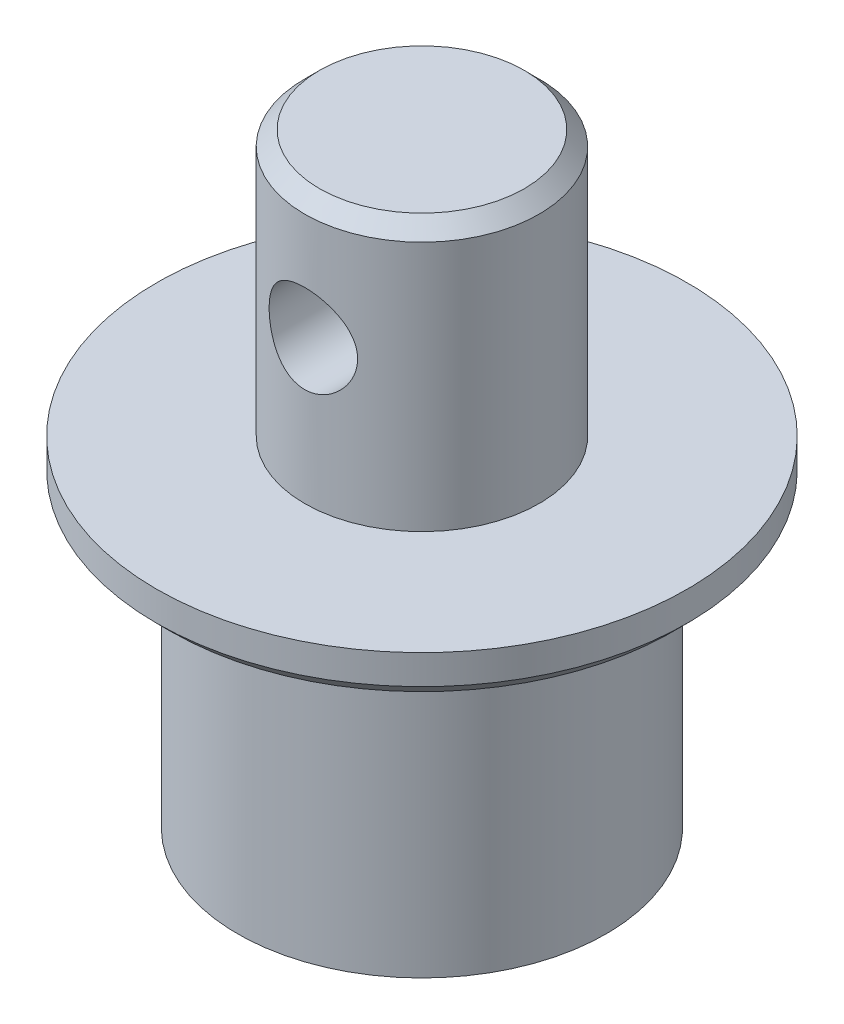
ISO-10303-21;
HEADER;
FILE_DESCRIPTION(('STEP AP214'),'2;1');
FILE_NAME('part.step','',(''),(''),'','','');
FILE_SCHEMA(('AUTOMOTIVE_DESIGN { 1 0 10303 214 1 1 1 1 }'));
ENDSEC;
DATA;
#1=APPLICATION_CONTEXT('core data for automotive mechanical design processes');
#2=APPLICATION_PROTOCOL_DEFINITION('international standard','automotive_design',2000,#1);
#3=PRODUCT_CONTEXT('',#1,'mechanical');
#4=PRODUCT('Part','Part','',(#3));
#5=PRODUCT_RELATED_PRODUCT_CATEGORY('part','',(#4));
#6=PRODUCT_DEFINITION_FORMATION('','',#4);
#7=PRODUCT_DEFINITION_CONTEXT('part definition',#1,'design');
#8=PRODUCT_DEFINITION('design','',#6,#7);
#9=PRODUCT_DEFINITION_SHAPE('','',#8);
#10=(LENGTH_UNIT() NAMED_UNIT(*) SI_UNIT(.MILLI.,.METRE.));
#11=(NAMED_UNIT(*) PLANE_ANGLE_UNIT() SI_UNIT($,.RADIAN.));
#12=(NAMED_UNIT(*) SI_UNIT($,.STERADIAN.) SOLID_ANGLE_UNIT());
#13=UNCERTAINTY_MEASURE_WITH_UNIT(LENGTH_MEASURE(1.E-05),#10,'distance_accuracy_value','');
#14=(GEOMETRIC_REPRESENTATION_CONTEXT(3) GLOBAL_UNCERTAINTY_ASSIGNED_CONTEXT((#13)) GLOBAL_UNIT_ASSIGNED_CONTEXT((#10,
#11,#12)) REPRESENTATION_CONTEXT('',''));
#15=CARTESIAN_POINT('',(0.,0.,0.));
#16=DIRECTION('',(0.,0.,1.));
#17=DIRECTION('',(1.,0.,0.));
#18=AXIS2_PLACEMENT_3D('',#15,#16,#17);
#19=CARTESIAN_POINT('',(0.,18.,0.));
#20=DIRECTION('',(0.,-1.,0.));
#21=DIRECTION('',(0.,0.,-1.));
#22=AXIS2_PLACEMENT_3D('',#19,#20,#21);
#23=CYLINDRICAL_SURFACE('',#22,7.95);
#24=CARTESIAN_POINT('',(0.,12.7,-7.95));
#25=CARTESIAN_POINT('',(-0.162397491346748,12.7000061558222,-7.95000463305476));
#26=CARTESIAN_POINT('',(-0.324753099848184,12.686772434708,-7.94498084128038));
#27=CARTESIAN_POINT('',(-0.644608276496746,12.6344046885734,-7.92544254710234));
#28=CARTESIAN_POINT('',(-0.802108607238702,12.5952747528614,-7.91092954315817));
#29=CARTESIAN_POINT('',(-1.10759384707584,12.4926982224202,-7.87396945860854));
#30=CARTESIAN_POINT('',(-1.25559660387506,12.4292988958457,-7.85153780728387));
#31=CARTESIAN_POINT('',(-1.53885384506537,12.2802252539554,-7.80097147100144));
#32=CARTESIAN_POINT('',(-1.67410485143574,12.1945448853293,-7.77283523668182));
#33=CARTESIAN_POINT('',(-1.93382546780257,11.9995011008524,-7.71241146666441));
#34=CARTESIAN_POINT('',(-2.05767538384719,11.8893495621118,-7.68000542519286));
#35=CARTESIAN_POINT('',(-2.28564512635348,11.6501633262448,-7.61527381268037));
#36=CARTESIAN_POINT('',(-2.38975880250598,11.5211227649516,-7.58294826981162));
#37=CARTESIAN_POINT('',(-2.57926636225751,11.2417374560993,-7.52065411531348));
#38=CARTESIAN_POINT('',(-2.6637805831916,11.0907618050901,-7.49082499932832));
#39=CARTESIAN_POINT('',(-2.80594178602416,10.7754371382371,-7.43874757327125));
#40=CARTESIAN_POINT('',(-2.86359965340992,10.611093572494,-7.41649619275682));
#41=CARTESIAN_POINT('',(-2.94795796885627,10.2808348690774,-7.38336190811873));
#42=CARTESIAN_POINT('',(-2.97584212262488,10.115266990026,-7.37204616258461));
#43=CARTESIAN_POINT('',(-3.00356228598173,9.7814451398545,-7.36079887492185));
#44=CARTESIAN_POINT('',(-3.00341006762254,9.61319232577162,-7.36086255474267));
#45=CARTESIAN_POINT('',(-2.97596618835097,9.28965599589298,-7.37199408836324));
#46=CARTESIAN_POINT('',(-2.950323119074,9.13420535263497,-7.38239348387374));
#47=CARTESIAN_POINT('',(-2.87535300460385,8.83000298266155,-7.41191277552078));
#48=CARTESIAN_POINT('',(-2.8260223465669,8.68125228161165,-7.43103400189338));
#49=CARTESIAN_POINT('',(-2.70418189216197,8.39133492929746,-7.47624078591974));
#50=CARTESIAN_POINT('',(-2.6312480533409,8.2503669739539,-7.50245218680417));
#51=CARTESIAN_POINT('',(-2.46456734066459,7.98219471048518,-7.55884475137268));
#52=CARTESIAN_POINT('',(-2.3708132173386,7.8549952194409,-7.58902729628462));
#53=CARTESIAN_POINT('',(-2.15763402761747,7.60885443691731,-7.65246921492573));
#54=CARTESIAN_POINT('',(-2.03689525756286,7.49106604037545,-7.68579812115875));
#55=CARTESIAN_POINT('',(-1.77699753283556,7.27706373431274,-7.75001160096118));
#56=CARTESIAN_POINT('',(-1.63783568074396,7.18085322479597,-7.78089578882361));
#57=CARTESIAN_POINT('',(-1.34207116187379,7.01144460931163,-7.8373678710877));
#58=CARTESIAN_POINT('',(-1.18522721144044,6.93863503487575,-7.86286415320891));
#59=CARTESIAN_POINT('',(-0.86031470200094,6.82081904211372,-7.90500692503182));
#60=CARTESIAN_POINT('',(-0.692251231753698,6.77580011265377,-7.92165739657785));
#61=CARTESIAN_POINT('',(-0.359369733398546,6.71707032438193,-7.94353018166807));
#62=CARTESIAN_POINT('',(-0.19486250407749,6.70180726332692,-7.94931845634064));
#63=CARTESIAN_POINT('',(0.134445660228267,6.69849692676496,-7.95056675753456));
#64=CARTESIAN_POINT('',(0.299246520773491,6.71044352644258,-7.94602910839152));
#65=CARTESIAN_POINT('',(0.617726140759181,6.76003703811891,-7.92750856979343));
#66=CARTESIAN_POINT('',(0.771587980773982,6.79666317138276,-7.91390105530444));
#67=CARTESIAN_POINT('',(1.07087124221814,6.89322789669408,-7.87898797802321));
#68=CARTESIAN_POINT('',(1.21629156356081,6.95316951937971,-7.85768141450416));
#69=CARTESIAN_POINT('',(1.49937620417867,7.09658093164373,-7.8086891601555));
#70=CARTESIAN_POINT('',(1.63668485220481,7.18069302598826,-7.78083372768987));
#71=CARTESIAN_POINT('',(1.89570132393103,7.36933296202654,-7.7218192041405));
#72=CARTESIAN_POINT('',(2.01740330922294,7.47386840734707,-7.6906588846264));
#73=CARTESIAN_POINT('',(2.24923419609776,7.70761385915857,-7.62618977395529));
#74=CARTESIAN_POINT('',(2.35826281750802,7.83791282891418,-7.59286232939511));
#75=CARTESIAN_POINT('',(2.55312943709526,8.1156069199928,-7.52957881379437));
#76=CARTESIAN_POINT('',(2.63896520992051,8.26300367990923,-7.49962306642862));
#77=CARTESIAN_POINT('',(2.78513438407435,8.57201209893149,-7.44658528316189));
#78=CARTESIAN_POINT('',(2.84534845350868,8.733686127761,-7.42353555585956));
#79=CARTESIAN_POINT('',(2.93729581964043,9.06599351023611,-7.38764350420071));
#80=CARTESIAN_POINT('',(2.96904704082561,9.23662115356447,-7.374794756358));
#81=CARTESIAN_POINT('',(3.00155503802499,9.57005302179686,-7.36161978142478));
#82=CARTESIAN_POINT('',(3.00419110375903,9.73264550820018,-7.36053436127972));
#83=CARTESIAN_POINT('',(2.98321973734044,10.0558276842463,-7.36905868877781));
#84=CARTESIAN_POINT('',(2.95961485946022,10.2164175672823,-7.37866739546335));
#85=CARTESIAN_POINT('',(2.88830176573362,10.5259293606051,-7.40686184253781));
#86=CARTESIAN_POINT('',(2.84137107510192,10.6750591479437,-7.42515720122094));
#87=CARTESIAN_POINT('',(2.72542723369112,10.963412785519,-7.46849099490141));
#88=CARTESIAN_POINT('',(2.65640846747208,11.1026341057172,-7.49353114436682));
#89=CARTESIAN_POINT('',(2.4940127469099,11.375226883347,-7.54918066261999));
#90=CARTESIAN_POINT('',(2.39954048534419,11.5078994030905,-7.58001455370614));
#91=CARTESIAN_POINT('',(2.19060617827199,11.7561080525092,-7.64301253026733));
#92=CARTESIAN_POINT('',(2.07613773887328,11.8716386790474,-7.67517703869663));
#93=CARTESIAN_POINT('',(1.82292686694646,12.0887750295145,-7.73934015838431));
#94=CARTESIAN_POINT('',(1.68319475235042,12.1892633965218,-7.7712320684291));
#95=CARTESIAN_POINT('',(1.38770505428977,12.365304905216,-7.82939530273651));
#96=CARTESIAN_POINT('',(1.23194587961074,12.4408555678737,-7.85566606811619));
#97=CARTESIAN_POINT('',(0.900729443719499,12.5673316594021,-7.90065816243918));
#98=CARTESIAN_POINT('',(0.72468257870646,12.6168806341044,-7.91895015266806));
#99=CARTESIAN_POINT('',(0.36573704474032,12.6832028472176,-7.94361537532247));
#100=CARTESIAN_POINT('',(0.182841976353428,12.6999930692113,-7.94999478368242));
#101=CARTESIAN_POINT('',(0.,12.7,-7.95));
#102=B_SPLINE_CURVE_WITH_KNOTS('',3,(#24,#25,#26,#27,#28,#29,#30,#31,#32,#33,#34,#35,#36,#37,
#38,#39,#40,#41,#42,#43,#44,#45,#46,#47,#48,#49,#50,#51,#52,#53,#54,#55,#56,#57,#58,#59,#60,#61,
#62,#63,#64,#65,#66,#67,#68,#69,#70,#71,#72,#73,#74,#75,#76,#77,#78,#79,#80,#81,#82,#83,#84,#85,
#86,#87,#88,#89,#90,#91,#92,#93,#94,#95,#96,#97,#98,#99,#100,#101),.UNSPECIFIED.,.T.,.F.,(4,2,2,
2,2,2,2,2,2,2,2,2,2,2,2,2,2,2,2,2,2,2,2,2,2,2,2,2,2,2,2,2,2,2,2,2,2,2,4),(0.,0.486517984474757,
0.972959160520783,1.45845770295972,1.94408828362444,2.44851024997547,2.95308914942897,
3.47718162143792,4.00106148167018,4.50323487057201,5.00519740487303,5.47667849204093,
5.94823151260985,6.42877607760176,6.90948822777715,7.42294833461538,7.93648929004924,
8.45816227693261,8.97960023906363,9.4730216283662,9.96633196092749,10.4403977118492,
10.9145251042877,11.4026484582173,11.8909538882842,12.4079529144854,12.9250015290952,
13.4444325927827,13.9635363143255,14.4489214843418,14.9342594114916,15.4044069203738,
15.8746740496895,16.36981560475,16.8651157749309,17.3876947690209,17.9103256964684,
18.4583764326353,19.0061429595389),.UNSPECIFIED.);
#103=CARTESIAN_POINT('',(0.,12.7,-7.95));
#104=VERTEX_POINT('',#103);
#105=EDGE_CURVE('E38',#104,#104,#102,.T.);
#106=ORIENTED_EDGE('',*,*,#105,.T.);
#107=EDGE_LOOP('',(#106));
#108=FACE_BOUND('',#107,.T.);
#109=CARTESIAN_POINT('',(3.,9.7,7.36223471508482));
#110=CARTESIAN_POINT('',(2.99998847638603,9.53818087912798,7.36224526269351));
#111=CARTESIAN_POINT('',(2.9868408533845,9.3762103722872,7.36763957602915));
#112=CARTESIAN_POINT('',(2.93479898105657,9.05725888996367,7.38851783959744));
#113=CARTESIAN_POINT('',(2.89590575612689,8.90027771621983,7.40400138838714));
#114=CARTESIAN_POINT('',(2.79402781177854,8.59586930724842,7.44304061076884));
#115=CARTESIAN_POINT('',(2.731101471071,8.44841992534473,7.46657670963436));
#116=CARTESIAN_POINT('',(2.58314510981222,8.16612081406447,7.51904250584225));
#117=CARTESIAN_POINT('',(2.49810836153358,8.03127493667398,7.54797384408236));
#118=CARTESIAN_POINT('',(2.30376153242717,7.77121232087998,7.60960064181843));
#119=CARTESIAN_POINT('',(2.19351841745457,7.64671904452181,7.64240778971228));
#120=CARTESIAN_POINT('',(1.95386685111475,7.41747705800545,7.70715883050975));
#121=CARTESIAN_POINT('',(1.82445425584252,7.31273262815022,7.73910253499114));
#122=CARTESIAN_POINT('',(1.5446329927432,7.12246295020474,7.79985728918744));
#123=CARTESIAN_POINT('',(1.3936537720354,7.03772592201908,7.82852214322748));
#124=CARTESIAN_POINT('',(1.07830992462711,6.89515458942065,7.87814508841391));
#125=CARTESIAN_POINT('',(0.913950027301735,6.83731082772747,7.89910588822244));
#126=CARTESIAN_POINT('',(0.584118525776006,6.75271083408455,7.93016590252776));
#127=CARTESIAN_POINT('',(0.419008191449069,6.72470854121812,7.9406990457691));
#128=CARTESIAN_POINT('',(0.0861182550130894,6.69659199426228,7.9512752587645));
#129=CARTESIAN_POINT('',(-0.0816604499755095,6.69646855740847,7.95132178261133));
#130=CARTESIAN_POINT('',(-0.406186165059413,6.7233915100908,7.94119442034515));
#131=CARTESIAN_POINT('',(-0.563064807507878,6.74907733331319,7.93153233504782));
#132=CARTESIAN_POINT('',(-0.870095460195534,6.82459864135385,7.90374636952053));
#133=CARTESIAN_POINT('',(-1.02024699260719,6.87443583868587,7.88562188924655));
#134=CARTESIAN_POINT('',(-1.31216781002694,6.9974680388243,7.84237373573117));
#135=CARTESIAN_POINT('',(-1.45378254871369,7.07099371538483,7.81715165701678));
#136=CARTESIAN_POINT('',(-1.72301698371786,7.23902153583117,7.76225605799518));
#137=CARTESIAN_POINT('',(-1.85063211474019,7.33353049219717,7.73258109302015));
#138=CARTESIAN_POINT('',(-2.09625291168491,7.54737826155229,7.66976135047149));
#139=CARTESIAN_POINT('',(-2.2132430127343,7.66785547278632,7.63651515908535));
#140=CARTESIAN_POINT('',(-2.42574456827632,7.92691204717986,7.57169953695764));
#141=CARTESIAN_POINT('',(-2.52125048739725,8.06549606102768,7.54013053993966));
#142=CARTESIAN_POINT('',(-2.69004722792075,8.36088829744311,7.48159976832992));
#143=CARTESIAN_POINT('',(-2.76278393320141,8.51803907720284,7.45475898596922));
#144=CARTESIAN_POINT('',(-2.880375100483,8.84363902404656,7.41012433225883));
#145=CARTESIAN_POINT('',(-2.92524531348823,9.0120817488069,7.39232535124068));
#146=CARTESIAN_POINT('',(-2.98350497294114,9.34543862821912,7.36899818161272));
#147=CARTESIAN_POINT('',(-2.99850974291805,9.51002612552786,7.36284132147711));
#148=CARTESIAN_POINT('',(-3.00127750176349,9.83944639008965,7.36171480133552));
#149=CARTESIAN_POINT('',(-2.98904742268387,10.0042790842612,7.36674229458981));
#150=CARTESIAN_POINT('',(-2.93915784101862,10.3211629550074,7.38677890427645));
#151=CARTESIAN_POINT('',(-2.90275536170076,10.4734469127311,7.40129408111521));
#152=CARTESIAN_POINT('',(-2.80714040331809,10.7696728223296,7.43808226609779));
#153=CARTESIAN_POINT('',(-2.74792321527995,10.9136130449902,7.46035687570344));
#154=CARTESIAN_POINT('',(-2.60584361626127,11.1951164240263,7.51118902933162));
#155=CARTESIAN_POINT('',(-2.5221722334124,11.3322330449096,7.53995219207521));
#156=CARTESIAN_POINT('',(-2.33441687648243,11.5910526702668,7.60017799915619));
#157=CARTESIAN_POINT('',(-2.2303253503514,11.7127499446626,7.63164163979143));
#158=CARTESIAN_POINT('',(-1.99676156560833,11.9453999274485,7.69616935064396));
#159=CARTESIAN_POINT('',(-1.86608723424952,12.055157597863,7.72920614910852));
#160=CARTESIAN_POINT('',(-1.5873664361605,12.2513337907439,7.79122096312534));
#161=CARTESIAN_POINT('',(-1.43931986006059,12.3377521662627,7.82019895312222));
#162=CARTESIAN_POINT('',(-1.13009967886562,12.4842477994431,7.87082025135715));
#163=CARTESIAN_POINT('',(-0.968969651016516,12.5444085640794,7.89248676165433));
#164=CARTESIAN_POINT('',(-0.637870931627841,12.6364273074365,7.9261118932038));
#165=CARTESIAN_POINT('',(-0.467906493780563,12.6682987760011,7.9380751412537));
#166=CARTESIAN_POINT('',(-0.134758318572021,12.7013659427001,7.95050234819133));
#167=CARTESIAN_POINT('',(0.0282347182748412,12.7042587720064,7.95160244842512));
#168=CARTESIAN_POINT('',(0.352286714056232,12.6836626905325,7.94384354853882));
#169=CARTESIAN_POINT('',(0.513345908784079,12.6601770297837,7.93498577530464));
#170=CARTESIAN_POINT('',(0.824872903926982,12.5886848977638,7.90859918182994));
#171=CARTESIAN_POINT('',(0.975504704927181,12.5413048913794,7.89129223621013));
#172=CARTESIAN_POINT('',(1.26668938334082,12.4239952510697,7.84981845145297));
#173=CARTESIAN_POINT('',(1.407240345928,12.3540613468895,7.82565031335174));
#174=CARTESIAN_POINT('',(1.68078304743255,12.1902710199168,7.77159770902848));
#175=CARTESIAN_POINT('',(1.81320405662409,12.0955282806332,7.74151478259925));
#176=CARTESIAN_POINT('',(2.06079145832988,11.886191784806,7.67932043381079));
#177=CARTESIAN_POINT('',(2.17595163342778,11.7715909071818,7.64720828641126));
#178=CARTESIAN_POINT('',(2.39209703979936,11.5185257698201,7.58246561904029));
#179=CARTESIAN_POINT('',(2.49199147751535,11.3791116040763,7.54989958951667));
#180=CARTESIAN_POINT('',(2.66701047282742,11.0843339824656,7.48987098387787));
#181=CARTESIAN_POINT('',(2.74213185351583,10.9289684843405,7.46240906251267));
#182=CARTESIAN_POINT('',(2.83572851156726,10.6832960070156,7.427133469645));
#183=CARTESIAN_POINT('',(2.86416654860317,10.5971118170317,7.41618073356408));
#184=CARTESIAN_POINT('',(2.91317517775546,10.4222468796589,7.39706747795765));
#185=CARTESIAN_POINT('',(2.93374932570495,10.3335672801464,7.38890569661591));
#186=CARTESIAN_POINT('',(2.96676758310502,10.1545045054933,7.37571079709818));
#187=CARTESIAN_POINT('',(2.97921437058769,10.0641219016166,7.37067664836809));
#188=CARTESIAN_POINT('',(2.99583331277785,9.88250884982683,7.36393584017285));
#189=CARTESIAN_POINT('',(3.00000650021022,9.79127850915807,7.36222876541712));
#190=CARTESIAN_POINT('',(3.,9.7,7.36223471508482));
#191=B_SPLINE_CURVE_WITH_KNOTS('',3,(#109,#110,#111,#112,#113,#114,#115,#116,#117,#118,#119,
#120,#121,#122,#123,#124,#125,#126,#127,#128,#129,#130,#131,#132,#133,#134,#135,#136,#137,#138,
#139,#140,#141,#142,#143,#144,#145,#146,#147,#148,#149,#150,#151,#152,#153,#154,#155,#156,#157,
#158,#159,#160,#161,#162,#163,#164,#165,#166,#167,#168,#169,#170,#171,#172,#173,#174,#175,#176,
#177,#178,#179,#180,#181,#182,#183,#184,#185,#186,#187,#188,#189,#190),.UNSPECIFIED.,.T.,.F.,(4,
2,2,2,2,2,2,2,2,2,2,2,2,2,2,2,2,2,2,2,2,2,2,2,2,2,2,2,2,2,2,2,2,2,2,2,2,2,2,2,4),(0.,
0.485113019094003,0.97020673709227,1.45412953481374,1.93819975263346,2.44443134249792,
2.95077252559746,3.47459178516768,3.99822669897873,4.49901899995725,4.99964634924538,
5.47519839146572,5.95078415883133,6.43331940839045,6.91601154864105,7.42726811632732,
7.93865625811923,8.46166485432304,8.98437756017793,9.47795435847515,9.97140554165079,
10.4410183842214,10.9107282072142,11.3981880218201,11.885828456347,12.4048427572537,
12.9238603258718,13.4412150191416,13.9583228773832,14.444955850278,14.9315288728514,
15.4059609368032,15.8804828804031,16.3750646117023,16.8698240672408,17.3911057262614,
17.9124542086976,18.1863439084664,18.4601096159644,18.7337850698281,19.0074263609033),.UNSPECIFIED.);
#192=CARTESIAN_POINT('',(3.,9.7,7.36223471508482));
#193=VERTEX_POINT('',#192);
#194=EDGE_CURVE('E71',#193,#193,#191,.T.);
#195=ORIENTED_EDGE('',*,*,#194,.T.);
#196=EDGE_LOOP('',(#195));
#197=FACE_BOUND('',#196,.T.);
#198=CARTESIAN_POINT('',(0.,17.,0.));
#199=DIRECTION('',(0.,1.,0.));
#200=DIRECTION('',(0.,0.,1.));
#201=AXIS2_PLACEMENT_3D('',#198,#199,#200);
#202=CIRCLE('',#201,7.95);
#203=CARTESIAN_POINT('',(0.,17.,7.95));
#204=VERTEX_POINT('',#203);
#205=EDGE_CURVE('E67',#204,#204,#202,.F.);
#206=ORIENTED_EDGE('',*,*,#205,.T.);
#207=EDGE_LOOP('',(#206));
#208=FACE_BOUND('',#207,.T.);
#209=CARTESIAN_POINT('',(0.,0.,0.));
#210=DIRECTION('',(0.,1.,0.));
#211=DIRECTION('',(0.,0.,1.));
#212=AXIS2_PLACEMENT_3D('',#209,#210,#211);
#213=CIRCLE('',#212,7.95);
#214=CARTESIAN_POINT('',(0.,0.,7.95));
#215=VERTEX_POINT('',#214);
#216=EDGE_CURVE('E61',#215,#215,#213,.T.);
#217=ORIENTED_EDGE('',*,*,#216,.T.);
#218=EDGE_LOOP('',(#217));
#219=FACE_BOUND('',#218,.T.);
#220=ADVANCED_FACE('F33',(#108,#197,#208,#219),#23,.T.);
#221=CARTESIAN_POINT('',(0.,18.,0.));
#222=DIRECTION('',(0.,1.,0.));
#223=DIRECTION('',(0.,0.,1.));
#224=AXIS2_PLACEMENT_3D('',#221,#222,#223);
#225=PLANE('',#224);
#226=CARTESIAN_POINT('',(0.,18.,0.));
#227=DIRECTION('',(0.,1.,0.));
#228=DIRECTION('',(0.,0.,1.));
#229=AXIS2_PLACEMENT_3D('',#226,#227,#228);
#230=CIRCLE('',#229,6.95);
#231=CARTESIAN_POINT('',(0.,18.,6.95));
#232=VERTEX_POINT('',#231);
#233=EDGE_CURVE('E64',#232,#232,#230,.T.);
#234=ORIENTED_EDGE('',*,*,#233,.T.);
#235=EDGE_LOOP('',(#234));
#236=FACE_BOUND('',#235,.T.);
#237=ADVANCED_FACE('F108',(#236),#225,.T.);
#238=CARTESIAN_POINT('',(0.,18.,0.));
#239=DIRECTION('',(0.,-1.,0.));
#240=DIRECTION('',(0.,0.,-1.));
#241=AXIS2_PLACEMENT_3D('',#238,#239,#240);
#242=CONICAL_SURFACE('',#241,6.95,0.785398163397444);
#243=ORIENTED_EDGE('',*,*,#205,.F.);
#244=EDGE_LOOP('',(#243));
#245=FACE_BOUND('',#244,.T.);
#246=ORIENTED_EDGE('',*,*,#233,.F.);
#247=EDGE_LOOP('',(#246));
#248=FACE_BOUND('',#247,.T.);
#249=ADVANCED_FACE('F106',(#245,#248),#242,.T.);
#250=CARTESIAN_POINT('',(0.,-3.,0.));
#251=DIRECTION('',(0.,1.,0.));
#252=DIRECTION('',(0.,0.,1.));
#253=AXIS2_PLACEMENT_3D('',#250,#251,#252);
#254=CYLINDRICAL_SURFACE('',#253,18.);
#255=CARTESIAN_POINT('',(0.,-2.,0.));
#256=DIRECTION('',(0.,1.,0.));
#257=DIRECTION('',(0.,0.,1.));
#258=AXIS2_PLACEMENT_3D('',#255,#256,#257);
#259=CIRCLE('',#258,18.);
#260=CARTESIAN_POINT('',(0.,-2.,18.));
#261=VERTEX_POINT('',#260);
#262=EDGE_CURVE('E52',#261,#261,#259,.T.);
#263=ORIENTED_EDGE('',*,*,#262,.T.);
#264=EDGE_LOOP('',(#263));
#265=FACE_BOUND('',#264,.T.);
#266=CARTESIAN_POINT('',(0.,0.,0.));
#267=DIRECTION('',(0.,1.,0.));
#268=DIRECTION('',(0.,0.,1.));
#269=AXIS2_PLACEMENT_3D('',#266,#267,#268);
#270=CIRCLE('',#269,18.);
#271=CARTESIAN_POINT('',(0.,0.,18.));
#272=VERTEX_POINT('',#271);
#273=EDGE_CURVE('E58',#272,#272,#270,.T.);
#274=ORIENTED_EDGE('',*,*,#273,.F.);
#275=EDGE_LOOP('',(#274));
#276=FACE_BOUND('',#275,.T.);
#277=ADVANCED_FACE('F100',(#265,#276),#254,.T.);
#278=CARTESIAN_POINT('',(0.,-3.,0.));
#279=DIRECTION('',(0.,1.,0.));
#280=DIRECTION('',(0.,0.,1.));
#281=AXIS2_PLACEMENT_3D('',#278,#279,#280);
#282=PLANE('',#281);
#283=CARTESIAN_POINT('',(0.,-3.,0.));
#284=DIRECTION('',(0.,-1.,0.));
#285=DIRECTION('',(0.,0.,-1.));
#286=AXIS2_PLACEMENT_3D('',#283,#284,#285);
#287=CIRCLE('',#286,12.5);
#288=CARTESIAN_POINT('',(0.,-3.,-12.5));
#289=VERTEX_POINT('',#288);
#290=EDGE_CURVE('E10',#289,#289,#287,.T.);
#291=ORIENTED_EDGE('',*,*,#290,.F.);
#292=EDGE_LOOP('',(#291));
#293=FACE_BOUND('',#292,.T.);
#294=CARTESIAN_POINT('',(0.,-3.,0.));
#295=DIRECTION('',(0.,1.,0.));
#296=DIRECTION('',(0.,0.,1.));
#297=AXIS2_PLACEMENT_3D('',#294,#295,#296);
#298=CIRCLE('',#297,17.);
#299=CARTESIAN_POINT('',(0.,-3.,17.));
#300=VERTEX_POINT('',#299);
#301=EDGE_CURVE('E47',#300,#300,#298,.F.);
#302=ORIENTED_EDGE('',*,*,#301,.T.);
#303=EDGE_LOOP('',(#302));
#304=FACE_BOUND('',#303,.T.);
#305=ADVANCED_FACE('F96',(#293,#304),#282,.F.);
#306=CARTESIAN_POINT('',(0.,0.,0.));
#307=DIRECTION('',(0.,1.,0.));
#308=DIRECTION('',(0.,0.,1.));
#309=AXIS2_PLACEMENT_3D('',#306,#307,#308);
#310=PLANE('',#309);
#311=ORIENTED_EDGE('',*,*,#216,.F.);
#312=EDGE_LOOP('',(#311));
#313=FACE_BOUND('',#312,.T.);
#314=ORIENTED_EDGE('',*,*,#273,.T.);
#315=EDGE_LOOP('',(#314));
#316=FACE_BOUND('',#315,.T.);
#317=ADVANCED_FACE('F99',(#313,#316),#310,.T.);
#318=CARTESIAN_POINT('',(0.,-2.,0.));
#319=DIRECTION('',(0.,1.,0.));
#320=DIRECTION('',(0.,0.,1.));
#321=AXIS2_PLACEMENT_3D('',#318,#319,#320);
#322=CONICAL_SURFACE('',#321,18.,0.78539816339745);
#323=ORIENTED_EDGE('',*,*,#301,.F.);
#324=EDGE_LOOP('',(#323));
#325=FACE_BOUND('',#324,.T.);
#326=ORIENTED_EDGE('',*,*,#262,.F.);
#327=EDGE_LOOP('',(#326));
#328=FACE_BOUND('',#327,.T.);
#329=ADVANCED_FACE('F36',(#325,#328),#322,.T.);
#330=CARTESIAN_POINT('',(0.,-23.,0.));
#331=DIRECTION('',(0.,1.,0.));
#332=DIRECTION('',(0.,0.,1.));
#333=AXIS2_PLACEMENT_3D('',#330,#331,#332);
#334=CYLINDRICAL_SURFACE('',#333,12.5);
#335=CARTESIAN_POINT('',(0.,-23.,0.));
#336=DIRECTION('',(0.,-1.,0.));
#337=DIRECTION('',(0.,0.,-1.));
#338=AXIS2_PLACEMENT_3D('',#335,#336,#337);
#339=CIRCLE('',#338,12.5);
#340=CARTESIAN_POINT('',(0.,-23.,-12.5));
#341=VERTEX_POINT('',#340);
#342=EDGE_CURVE('E56',#341,#341,#339,.T.);
#343=ORIENTED_EDGE('',*,*,#342,.F.);
#344=EDGE_LOOP('',(#343));
#345=FACE_BOUND('',#344,.T.);
#346=ORIENTED_EDGE('',*,*,#290,.T.);
#347=EDGE_LOOP('',(#346));
#348=FACE_BOUND('',#347,.T.);
#349=ADVANCED_FACE('F91',(#345,#348),#334,.T.);
#350=CARTESIAN_POINT('',(0.,-23.,0.));
#351=DIRECTION('',(0.,-1.,0.));
#352=DIRECTION('',(0.,0.,-1.));
#353=AXIS2_PLACEMENT_3D('',#350,#351,#352);
#354=PLANE('',#353);
#355=CARTESIAN_POINT('',(0.,-23.,0.));
#356=DIRECTION('',(0.,-1.,0.));
#357=DIRECTION('',(0.,0.,-1.));
#358=AXIS2_PLACEMENT_3D('',#355,#356,#357);
#359=CIRCLE('',#358,7.95);
#360=CARTESIAN_POINT('',(0.,-23.,-7.95));
#361=VERTEX_POINT('',#360);
#362=EDGE_CURVE('E76',#361,#361,#359,.T.);
#363=ORIENTED_EDGE('',*,*,#362,.F.);
#364=EDGE_LOOP('',(#363));
#365=FACE_BOUND('',#364,.T.);
#366=ORIENTED_EDGE('',*,*,#342,.T.);
#367=EDGE_LOOP('',(#366));
#368=FACE_BOUND('',#367,.T.);
#369=ADVANCED_FACE('F85',(#365,#368),#354,.T.);
#370=CARTESIAN_POINT('',(0.,9.7,-18.));
#371=DIRECTION('',(0.,0.,1.));
#372=DIRECTION('',(1.,0.,0.));
#373=AXIS2_PLACEMENT_3D('',#370,#371,#372);
#374=CYLINDRICAL_SURFACE('',#373,3.);
#375=ORIENTED_EDGE('',*,*,#194,.F.);
#376=EDGE_LOOP('',(#375));
#377=FACE_BOUND('',#376,.T.);
#378=ORIENTED_EDGE('',*,*,#105,.F.);
#379=EDGE_LOOP('',(#378));
#380=FACE_BOUND('',#379,.T.);
#381=ADVANCED_FACE('F79',(#377,#380),#374,.F.);
#382=CARTESIAN_POINT('',(0.,-45.4859956417322,0.));
#383=DIRECTION('',(0.,1.,0.));
#384=DIRECTION('',(0.,0.,1.));
#385=AXIS2_PLACEMENT_3D('',#382,#383,#384);
#386=CYLINDRICAL_SURFACE('',#385,7.95);
#387=CARTESIAN_POINT('',(0.,-13.,0.));
#388=DIRECTION('',(0.,-1.,0.));
#389=DIRECTION('',(0.,0.,-1.));
#390=AXIS2_PLACEMENT_3D('',#387,#388,#389);
#391=CIRCLE('',#390,7.95);
#392=CARTESIAN_POINT('',(0.,-13.,-7.95));
#393=VERTEX_POINT('',#392);
#394=EDGE_CURVE('E176',#393,#393,#391,.T.);
#395=ORIENTED_EDGE('',*,*,#394,.F.);
#396=EDGE_LOOP('',(#395));
#397=FACE_BOUND('',#396,.T.);
#398=ORIENTED_EDGE('',*,*,#362,.T.);
#399=EDGE_LOOP('',(#398));
#400=FACE_BOUND('',#399,.T.);
#401=ADVANCED_FACE('F84',(#397,#400),#386,.F.);
#402=CARTESIAN_POINT('',(0.,-13.,0.));
#403=DIRECTION('',(0.,-1.,0.));
#404=DIRECTION('',(0.,0.,-1.));
#405=AXIS2_PLACEMENT_3D('',#402,#403,#404);
#406=PLANE('',#405);
#407=ORIENTED_EDGE('',*,*,#394,.T.);
#408=EDGE_LOOP('',(#407));
#409=FACE_BOUND('',#408,.T.);
#410=ADVANCED_FACE('F162',(#409),#406,.T.);
#411=CLOSED_SHELL('',(#220,#237,#249,#277,#305,#317,#329,#349,#369,#381,#401,#410));
#412=MANIFOLD_SOLID_BREP('B2',#411);
#413=ADVANCED_BREP_SHAPE_REPRESENTATION('',(#18,#412),#14);
#414=SHAPE_DEFINITION_REPRESENTATION(#9,#413);
ENDSEC;
END-ISO-10303-21;
